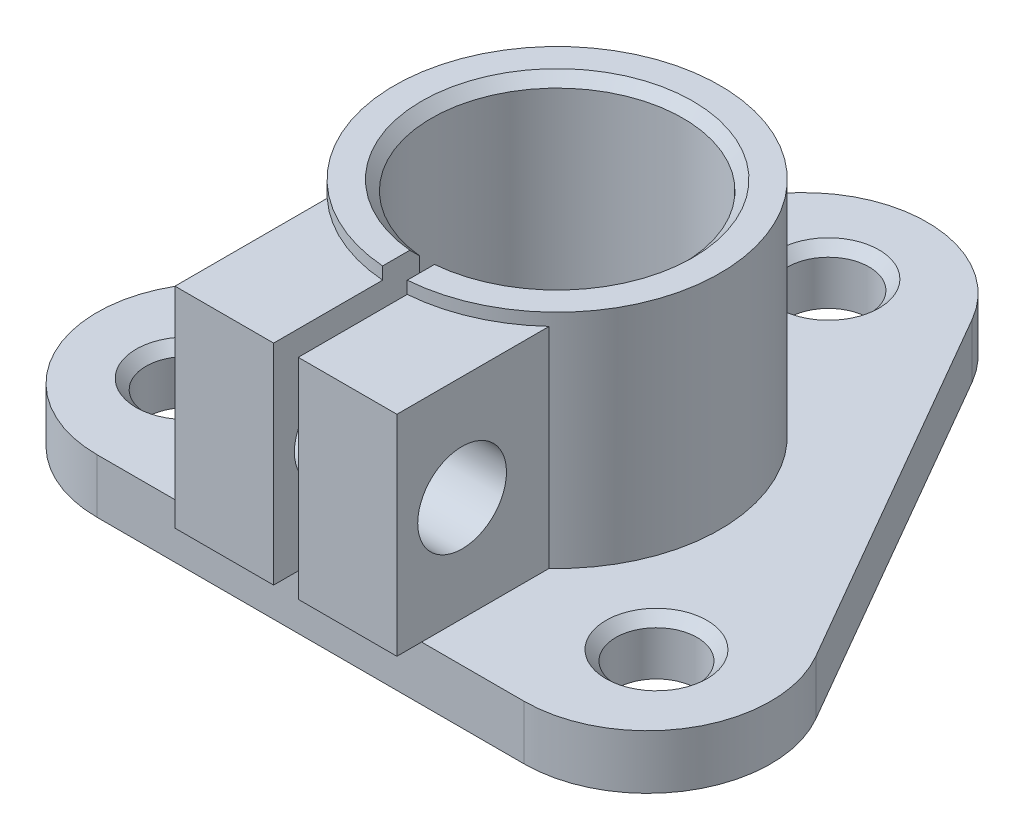
ISO-10303-21;
HEADER;
FILE_DESCRIPTION(('STEP AP214'),'2;1');
FILE_NAME('part.step','',(''),(''),'','','');
FILE_SCHEMA(('AUTOMOTIVE_DESIGN { 1 0 10303 214 1 1 1 1 }'));
ENDSEC;
DATA;
#1=APPLICATION_CONTEXT('core data for automotive mechanical design processes');
#2=APPLICATION_PROTOCOL_DEFINITION('international standard','automotive_design',2000,#1);
#3=PRODUCT_CONTEXT('',#1,'mechanical');
#4=PRODUCT('Part','Part','',(#3));
#5=PRODUCT_RELATED_PRODUCT_CATEGORY('part','',(#4));
#6=PRODUCT_DEFINITION_FORMATION('','',#4);
#7=PRODUCT_DEFINITION_CONTEXT('part definition',#1,'design');
#8=PRODUCT_DEFINITION('design','',#6,#7);
#9=PRODUCT_DEFINITION_SHAPE('','',#8);
#10=(LENGTH_UNIT() NAMED_UNIT(*) SI_UNIT(.MILLI.,.METRE.));
#11=(NAMED_UNIT(*) PLANE_ANGLE_UNIT() SI_UNIT($,.RADIAN.));
#12=(NAMED_UNIT(*) SI_UNIT($,.STERADIAN.) SOLID_ANGLE_UNIT());
#13=UNCERTAINTY_MEASURE_WITH_UNIT(LENGTH_MEASURE(1.E-05),#10,'distance_accuracy_value','');
#14=(GEOMETRIC_REPRESENTATION_CONTEXT(3) GLOBAL_UNCERTAINTY_ASSIGNED_CONTEXT((#13)) GLOBAL_UNIT_ASSIGNED_CONTEXT((#10,
#11,#12)) REPRESENTATION_CONTEXT('',''));
#15=CARTESIAN_POINT('',(0.,0.,0.));
#16=DIRECTION('',(0.,0.,1.));
#17=DIRECTION('',(1.,0.,0.));
#18=AXIS2_PLACEMENT_3D('',#15,#16,#17);
#19=CARTESIAN_POINT('',(0.,2.2,0.));
#20=DIRECTION('',(0.,1.,0.));
#21=DIRECTION('',(0.,0.,1.));
#22=AXIS2_PLACEMENT_3D('',#19,#20,#21);
#23=PLANE('',#22);
#24=DIRECTION('',(1.,0.,0.));
#25=VECTOR('',#24,1.);
#26=CARTESIAN_POINT('',(-17.3205080756888,2.2,10.));
#27=LINE('',#26,#25);
#28=CARTESIAN_POINT('',(-0.5,2.2,10.));
#29=VERTEX_POINT('',#28);
#30=CARTESIAN_POINT('',(0.5,2.2,10.));
#31=VERTEX_POINT('',#30);
#32=EDGE_CURVE('E309',#29,#31,#27,.T.);
#33=ORIENTED_EDGE('',*,*,#32,.T.);
#34=DIRECTION('',(0.,0.,-1.));
#35=VECTOR('',#34,1.);
#36=CARTESIAN_POINT('',(0.5,2.2,11.));
#37=LINE('',#36,#35);
#38=CARTESIAN_POINT('',(0.5,2.2,6.6));
#39=VERTEX_POINT('',#38);
#40=EDGE_CURVE('E531',#31,#39,#37,.T.);
#41=ORIENTED_EDGE('',*,*,#40,.T.);
#42=DIRECTION('',(-1.,0.,0.));
#43=VECTOR('',#42,1.);
#44=CARTESIAN_POINT('',(0.,2.2,6.6));
#45=LINE('',#44,#43);
#46=CARTESIAN_POINT('',(-0.499999999999999,2.2,6.6));
#47=VERTEX_POINT('',#46);
#48=EDGE_CURVE('E279',#39,#47,#45,.T.);
#49=ORIENTED_EDGE('',*,*,#48,.T.);
#50=DIRECTION('',(0.,0.,-1.));
#51=VECTOR('',#50,1.);
#52=CARTESIAN_POINT('',(-0.5,2.2,11.));
#53=LINE('',#52,#51);
#54=EDGE_CURVE('E247',#29,#47,#53,.T.);
#55=ORIENTED_EDGE('',*,*,#54,.F.);
#56=EDGE_LOOP('',(#33,#41,#49,#55));
#57=FACE_BOUND('',#56,.T.);
#58=ADVANCED_FACE('F49',(#57),#23,.T.);
#59=CARTESIAN_POINT('',(0.,2.2,-11.));
#60=DIRECTION('',(0.,1.,0.));
#61=DIRECTION('',(0.,0.,1.));
#62=AXIS2_PLACEMENT_3D('',#59,#60,#61);
#63=CIRCLE('',#62,2.04999999999999);
#64=CARTESIAN_POINT('',(0.,2.2,-8.95000000000001));
#65=VERTEX_POINT('',#64);
#66=EDGE_CURVE('E374',#65,#65,#63,.F.);
#67=ORIENTED_EDGE('',*,*,#66,.T.);
#68=EDGE_LOOP('',(#67));
#69=FACE_BOUND('',#68,.T.);
#70=CARTESIAN_POINT('',(9.52627944162883,2.2,5.5));
#71=DIRECTION('',(0.,1.,0.));
#72=DIRECTION('',(0.,0.,1.));
#73=AXIS2_PLACEMENT_3D('',#70,#71,#72);
#74=CIRCLE('',#73,2.05);
#75=CARTESIAN_POINT('',(9.52627944162883,2.2,7.55));
#76=VERTEX_POINT('',#75);
#77=EDGE_CURVE('E371',#76,#76,#74,.F.);
#78=ORIENTED_EDGE('',*,*,#77,.T.);
#79=EDGE_LOOP('',(#78));
#80=FACE_BOUND('',#79,.T.);
#81=CARTESIAN_POINT('',(-9.52627944162883,2.2,5.5));
#82=DIRECTION('',(0.,1.,0.));
#83=DIRECTION('',(0.,0.,1.));
#84=AXIS2_PLACEMENT_3D('',#81,#82,#83);
#85=CIRCLE('',#84,2.05);
#86=CARTESIAN_POINT('',(-9.52627944162883,2.2,7.55));
#87=VERTEX_POINT('',#86);
#88=EDGE_CURVE('E368',#87,#87,#85,.F.);
#89=ORIENTED_EDGE('',*,*,#88,.T.);
#90=EDGE_LOOP('',(#89));
#91=FACE_BOUND('',#90,.T.);
#92=CARTESIAN_POINT('',(0.,2.2,0.));
#93=DIRECTION('',(0.,1.,0.));
#94=DIRECTION('',(1.,0.,0.));
#95=AXIS2_PLACEMENT_3D('',#92,#93,#94);
#96=CIRCLE('',#95,6.6);
#97=CARTESIAN_POINT('',(4.5,2.2,4.82804308182932));
#98=VERTEX_POINT('',#97);
#99=CARTESIAN_POINT('',(-4.5,2.2,4.82804308182932));
#100=VERTEX_POINT('',#99);
#101=EDGE_CURVE('E287',#98,#100,#96,.T.);
#102=ORIENTED_EDGE('',*,*,#101,.F.);
#103=DIRECTION('',(0.,0.,-1.));
#104=VECTOR('',#103,1.);
#105=CARTESIAN_POINT('',(4.5,2.2,11.));
#106=LINE('',#105,#104);
#107=CARTESIAN_POINT('',(4.5,2.2,10.));
#108=VERTEX_POINT('',#107);
#109=EDGE_CURVE('E521',#108,#98,#106,.T.);
#110=ORIENTED_EDGE('',*,*,#109,.F.);
#111=CARTESIAN_POINT('',(8.66025403784438,2.2,10.));
#112=VERTEX_POINT('',#111);
#113=EDGE_CURVE('E310',#108,#112,#27,.T.);
#114=ORIENTED_EDGE('',*,*,#113,.T.);
#115=CARTESIAN_POINT('',(8.66025403784438,2.2,5.));
#116=DIRECTION('',(0.,1.,0.));
#117=DIRECTION('',(0.,0.,1.));
#118=AXIS2_PLACEMENT_3D('',#115,#116,#117);
#119=CIRCLE('',#118,5.);
#120=CARTESIAN_POINT('',(12.9903810567666,2.2,2.5));
#121=VERTEX_POINT('',#120);
#122=EDGE_CURVE('E345',#112,#121,#119,.T.);
#123=ORIENTED_EDGE('',*,*,#122,.T.);
#124=DIRECTION('',(-0.5,0.,-0.866025403784439));
#125=VECTOR('',#124,1.);
#126=CARTESIAN_POINT('',(17.3205080756888,2.2,10.));
#127=LINE('',#126,#125);
#128=CARTESIAN_POINT('',(4.3301270189222,2.2,-12.5));
#129=VERTEX_POINT('',#128);
#130=EDGE_CURVE('E308',#121,#129,#127,.T.);
#131=ORIENTED_EDGE('',*,*,#130,.T.);
#132=CARTESIAN_POINT('',(0.,2.2,-10.));
#133=DIRECTION('',(0.,1.,0.));
#134=DIRECTION('',(0.,0.,1.));
#135=AXIS2_PLACEMENT_3D('',#132,#133,#134);
#136=CIRCLE('',#135,5.);
#137=CARTESIAN_POINT('',(-4.33012701892219,2.2,-12.5));
#138=VERTEX_POINT('',#137);
#139=EDGE_CURVE('E341',#129,#138,#136,.T.);
#140=ORIENTED_EDGE('',*,*,#139,.T.);
#141=DIRECTION('',(-0.5,0.,0.866025403784439));
#142=VECTOR('',#141,1.);
#143=CARTESIAN_POINT('',(0.,2.2,-20.));
#144=LINE('',#143,#142);
#145=CARTESIAN_POINT('',(-12.9903810567666,2.2,2.50000000000001));
#146=VERTEX_POINT('',#145);
#147=EDGE_CURVE('E313',#138,#146,#144,.T.);
#148=ORIENTED_EDGE('',*,*,#147,.T.);
#149=CARTESIAN_POINT('',(-8.66025403784439,2.2,5.));
#150=DIRECTION('',(0.,1.,0.));
#151=DIRECTION('',(0.,0.,1.));
#152=AXIS2_PLACEMENT_3D('',#149,#150,#151);
#153=CIRCLE('',#152,5.);
#154=CARTESIAN_POINT('',(-8.66025403784439,2.2,10.));
#155=VERTEX_POINT('',#154);
#156=EDGE_CURVE('E343',#146,#155,#153,.T.);
#157=ORIENTED_EDGE('',*,*,#156,.T.);
#158=CARTESIAN_POINT('',(-4.5,2.2,10.));
#159=VERTEX_POINT('',#158);
#160=EDGE_CURVE('E305',#155,#159,#27,.T.);
#161=ORIENTED_EDGE('',*,*,#160,.T.);
#162=DIRECTION('',(0.,0.,-1.));
#163=VECTOR('',#162,1.);
#164=CARTESIAN_POINT('',(-4.5,2.2,11.));
#165=LINE('',#164,#163);
#166=EDGE_CURVE('E251',#159,#100,#165,.T.);
#167=ORIENTED_EDGE('',*,*,#166,.T.);
#168=EDGE_LOOP('',(#102,#110,#114,#123,#131,#140,#148,#157,#161,#167));
#169=FACE_BOUND('',#168,.T.);
#170=ADVANCED_FACE('F408',(#69,#80,#91,#169),#23,.T.);
#171=CARTESIAN_POINT('',(0.,11.2,0.));
#172=DIRECTION('',(0.,-1.,0.));
#173=DIRECTION('',(0.,0.,-1.));
#174=AXIS2_PLACEMENT_3D('',#171,#172,#173);
#175=CYLINDRICAL_SURFACE('',#174,6.6);
#176=DIRECTION('',(0.,-1.,0.));
#177=VECTOR('',#176,1.);
#178=CARTESIAN_POINT('',(4.5,11.2,4.82804308182932));
#179=LINE('',#178,#177);
#180=CARTESIAN_POINT('',(4.5,10.7,4.82804308182932));
#181=VERTEX_POINT('',#180);
#182=EDGE_CURVE('E223',#98,#181,#179,.F.);
#183=ORIENTED_EDGE('',*,*,#182,.F.);
#184=ORIENTED_EDGE('',*,*,#101,.T.);
#185=DIRECTION('',(0.,-1.,0.));
#186=VECTOR('',#185,1.);
#187=CARTESIAN_POINT('',(-4.5,11.2,4.82804308182932));
#188=LINE('',#187,#186);
#189=CARTESIAN_POINT('',(-4.5,10.7,4.82804308182932));
#190=VERTEX_POINT('',#189);
#191=EDGE_CURVE('E233',#190,#100,#188,.T.);
#192=ORIENTED_EDGE('',*,*,#191,.F.);
#193=CARTESIAN_POINT('',(0.,10.7,0.));
#194=DIRECTION('',(0.,1.,0.));
#195=DIRECTION('',(0.,0.,1.));
#196=AXIS2_PLACEMENT_3D('',#193,#194,#195);
#197=CIRCLE('',#196,6.6);
#198=CARTESIAN_POINT('',(-0.5,10.7,6.58103335350916));
#199=VERTEX_POINT('',#198);
#200=EDGE_CURVE('E232',#199,#190,#197,.F.);
#201=ORIENTED_EDGE('',*,*,#200,.F.);
#202=DIRECTION('',(0.,-1.,0.));
#203=VECTOR('',#202,1.);
#204=CARTESIAN_POINT('',(-0.499999999999999,11.2,6.58103335350916));
#205=LINE('',#204,#203);
#206=CARTESIAN_POINT('',(-0.499999999999999,11.2,6.58103335350916));
#207=VERTEX_POINT('',#206);
#208=EDGE_CURVE('E354',#199,#207,#205,.F.);
#209=ORIENTED_EDGE('',*,*,#208,.T.);
#210=CARTESIAN_POINT('',(0.,11.2,0.));
#211=DIRECTION('',(0.,1.,0.));
#212=DIRECTION('',(1.,0.,0.));
#213=AXIS2_PLACEMENT_3D('',#210,#211,#212);
#214=CIRCLE('',#213,6.6);
#215=CARTESIAN_POINT('',(0.500000000000001,11.2,6.58103335350916));
#216=VERTEX_POINT('',#215);
#217=EDGE_CURVE('E288',#216,#207,#214,.T.);
#218=ORIENTED_EDGE('',*,*,#217,.F.);
#219=DIRECTION('',(0.,-1.,0.));
#220=VECTOR('',#219,1.);
#221=CARTESIAN_POINT('',(0.500000000000001,11.2,6.58103335350916));
#222=LINE('',#221,#220);
#223=CARTESIAN_POINT('',(0.500000000000001,10.7,6.58103335350916));
#224=VERTEX_POINT('',#223);
#225=EDGE_CURVE('E352',#224,#216,#222,.F.);
#226=ORIENTED_EDGE('',*,*,#225,.F.);
#227=CARTESIAN_POINT('',(0.,10.7,0.));
#228=DIRECTION('',(0.,1.,0.));
#229=DIRECTION('',(0.,0.,1.));
#230=AXIS2_PLACEMENT_3D('',#227,#228,#229);
#231=CIRCLE('',#230,6.6);
#232=EDGE_CURVE('E212',#181,#224,#231,.F.);
#233=ORIENTED_EDGE('',*,*,#232,.F.);
#234=EDGE_LOOP('',(#183,#184,#192,#201,#209,#218,#226,#233));
#235=FACE_BOUND('',#234,.T.);
#236=ADVANCED_FACE('F404',(#235),#175,.T.);
#237=CARTESIAN_POINT('',(-17.3205080756888,2.2,10.));
#238=DIRECTION('',(0.,0.,-1.));
#239=DIRECTION('',(-1.,0.,0.));
#240=AXIS2_PLACEMENT_3D('',#237,#238,#239);
#241=PLANE('',#240);
#242=DIRECTION('',(1.,0.,0.));
#243=VECTOR('',#242,1.);
#244=CARTESIAN_POINT('',(-17.3205080756888,0.,10.));
#245=LINE('',#244,#243);
#246=CARTESIAN_POINT('',(-8.66025403784439,0.,10.));
#247=VERTEX_POINT('',#246);
#248=CARTESIAN_POINT('',(8.66025403784438,0.,10.));
#249=VERTEX_POINT('',#248);
#250=EDGE_CURVE('E299',#247,#249,#245,.T.);
#251=ORIENTED_EDGE('',*,*,#250,.T.);
#252=DIRECTION('',(0.,-1.,0.));
#253=VECTOR('',#252,1.);
#254=CARTESIAN_POINT('',(8.66025403784438,2.2,10.));
#255=LINE('',#254,#253);
#256=EDGE_CURVE('E338',#249,#112,#255,.F.);
#257=ORIENTED_EDGE('',*,*,#256,.T.);
#258=ORIENTED_EDGE('',*,*,#113,.F.);
#259=DIRECTION('',(1.,0.,0.));
#260=VECTOR('',#259,1.);
#261=CARTESIAN_POINT('',(-17.3205080756888,2.2,10.));
#262=LINE('',#261,#260);
#263=EDGE_CURVE('E230',#31,#108,#262,.T.);
#264=ORIENTED_EDGE('',*,*,#263,.F.);
#265=ORIENTED_EDGE('',*,*,#32,.F.);
#266=DIRECTION('',(1.,0.,0.));
#267=VECTOR('',#266,1.);
#268=CARTESIAN_POINT('',(-17.3205080756888,2.2,10.));
#269=LINE('',#268,#267);
#270=EDGE_CURVE('E261',#159,#29,#269,.T.);
#271=ORIENTED_EDGE('',*,*,#270,.F.);
#272=ORIENTED_EDGE('',*,*,#160,.F.);
#273=DIRECTION('',(0.,-1.,0.));
#274=VECTOR('',#273,1.);
#275=CARTESIAN_POINT('',(-8.66025403784439,2.2,10.));
#276=LINE('',#275,#274);
#277=EDGE_CURVE('E335',#155,#247,#276,.T.);
#278=ORIENTED_EDGE('',*,*,#277,.T.);
#279=EDGE_LOOP('',(#251,#257,#258,#264,#265,#271,#272,#278));
#280=FACE_BOUND('',#279,.T.);
#281=ADVANCED_FACE('F407',(#280),#241,.F.);
#282=CARTESIAN_POINT('',(17.3205080756888,2.2,10.));
#283=DIRECTION('',(-0.866025403784439,0.,0.5));
#284=DIRECTION('',(0.5,0.,0.866025403784439));
#285=AXIS2_PLACEMENT_3D('',#282,#283,#284);
#286=PLANE('',#285);
#287=ORIENTED_EDGE('',*,*,#130,.F.);
#288=DIRECTION('',(0.,-1.,0.));
#289=VECTOR('',#288,1.);
#290=CARTESIAN_POINT('',(12.9903810567666,2.2,2.5));
#291=LINE('',#290,#289);
#292=CARTESIAN_POINT('',(12.9903810567666,0.,2.5));
#293=VERTEX_POINT('',#292);
#294=EDGE_CURVE('E326',#121,#293,#291,.T.);
#295=ORIENTED_EDGE('',*,*,#294,.T.);
#296=DIRECTION('',(-0.5,0.,-0.866025403784439));
#297=VECTOR('',#296,1.);
#298=CARTESIAN_POINT('',(17.3205080756888,0.,10.));
#299=LINE('',#298,#297);
#300=CARTESIAN_POINT('',(4.3301270189222,0.,-12.5));
#301=VERTEX_POINT('',#300);
#302=EDGE_CURVE('E319',#293,#301,#299,.T.);
#303=ORIENTED_EDGE('',*,*,#302,.T.);
#304=DIRECTION('',(0.,-1.,0.));
#305=VECTOR('',#304,1.);
#306=CARTESIAN_POINT('',(4.3301270189222,2.2,-12.5));
#307=LINE('',#306,#305);
#308=EDGE_CURVE('E316',#301,#129,#307,.F.);
#309=ORIENTED_EDGE('',*,*,#308,.T.);
#310=EDGE_LOOP('',(#287,#295,#303,#309));
#311=FACE_BOUND('',#310,.T.);
#312=ADVANCED_FACE('F435',(#311),#286,.F.);
#313=CARTESIAN_POINT('',(0.,2.2,-20.));
#314=DIRECTION('',(0.866025403784439,0.,0.5));
#315=DIRECTION('',(0.5,0.,-0.866025403784439));
#316=AXIS2_PLACEMENT_3D('',#313,#314,#315);
#317=PLANE('',#316);
#318=DIRECTION('',(-0.5,0.,0.866025403784439));
#319=VECTOR('',#318,1.);
#320=CARTESIAN_POINT('',(0.,0.,-20.));
#321=LINE('',#320,#319);
#322=CARTESIAN_POINT('',(-4.33012701892219,0.,-12.5));
#323=VERTEX_POINT('',#322);
#324=CARTESIAN_POINT('',(-12.9903810567666,0.,2.50000000000001));
#325=VERTEX_POINT('',#324);
#326=EDGE_CURVE('E322',#323,#325,#321,.T.);
#327=ORIENTED_EDGE('',*,*,#326,.T.);
#328=DIRECTION('',(0.,-1.,0.));
#329=VECTOR('',#328,1.);
#330=CARTESIAN_POINT('',(-12.9903810567666,2.2,2.5));
#331=LINE('',#330,#329);
#332=EDGE_CURVE('E350',#325,#146,#331,.F.);
#333=ORIENTED_EDGE('',*,*,#332,.T.);
#334=ORIENTED_EDGE('',*,*,#147,.F.);
#335=DIRECTION('',(0.,-1.,0.));
#336=VECTOR('',#335,1.);
#337=CARTESIAN_POINT('',(-4.33012701892219,2.2,-12.5));
#338=LINE('',#337,#336);
#339=EDGE_CURVE('E347',#138,#323,#338,.T.);
#340=ORIENTED_EDGE('',*,*,#339,.T.);
#341=EDGE_LOOP('',(#327,#333,#334,#340));
#342=FACE_BOUND('',#341,.T.);
#343=ADVANCED_FACE('F431',(#342),#317,.F.);
#344=CARTESIAN_POINT('',(0.,0.,0.));
#345=DIRECTION('',(0.,1.,0.));
#346=DIRECTION('',(0.,0.,1.));
#347=AXIS2_PLACEMENT_3D('',#344,#345,#346);
#348=PLANE('',#347);
#349=CARTESIAN_POINT('',(0.,0.,0.));
#350=DIRECTION('',(0.,1.,0.));
#351=DIRECTION('',(0.,0.,1.));
#352=AXIS2_PLACEMENT_3D('',#349,#350,#351);
#353=CIRCLE('',#352,5.1);
#354=CARTESIAN_POINT('',(0.,0.,5.1));
#355=VERTEX_POINT('',#354);
#356=EDGE_CURVE('E291',#355,#355,#353,.F.);
#357=ORIENTED_EDGE('',*,*,#356,.F.);
#358=EDGE_LOOP('',(#357));
#359=FACE_BOUND('',#358,.T.);
#360=CARTESIAN_POINT('',(0.,0.,-11.));
#361=DIRECTION('',(0.,1.,0.));
#362=DIRECTION('',(0.,0.,1.));
#363=AXIS2_PLACEMENT_3D('',#360,#361,#362);
#364=CIRCLE('',#363,1.65);
#365=CARTESIAN_POINT('',(0.,0.,-9.35));
#366=VERTEX_POINT('',#365);
#367=EDGE_CURVE('E296',#366,#366,#364,.F.);
#368=ORIENTED_EDGE('',*,*,#367,.F.);
#369=EDGE_LOOP('',(#368));
#370=FACE_BOUND('',#369,.T.);
#371=CARTESIAN_POINT('',(9.52627944162883,0.,5.5));
#372=DIRECTION('',(0.,1.,0.));
#373=DIRECTION('',(0.,0.,1.));
#374=AXIS2_PLACEMENT_3D('',#371,#372,#373);
#375=CIRCLE('',#374,1.65);
#376=CARTESIAN_POINT('',(9.52627944162883,0.,7.15));
#377=VERTEX_POINT('',#376);
#378=EDGE_CURVE('E300',#377,#377,#375,.F.);
#379=ORIENTED_EDGE('',*,*,#378,.F.);
#380=EDGE_LOOP('',(#379));
#381=FACE_BOUND('',#380,.T.);
#382=CARTESIAN_POINT('',(-9.52627944162883,0.,5.5));
#383=DIRECTION('',(0.,1.,0.));
#384=DIRECTION('',(0.,0.,1.));
#385=AXIS2_PLACEMENT_3D('',#382,#383,#384);
#386=CIRCLE('',#385,1.65);
#387=CARTESIAN_POINT('',(-9.52627944162883,0.,7.15));
#388=VERTEX_POINT('',#387);
#389=EDGE_CURVE('E295',#388,#388,#386,.F.);
#390=ORIENTED_EDGE('',*,*,#389,.F.);
#391=EDGE_LOOP('',(#390));
#392=FACE_BOUND('',#391,.T.);
#393=ORIENTED_EDGE('',*,*,#302,.F.);
#394=CARTESIAN_POINT('',(8.66025403784438,0.,5.));
#395=DIRECTION('',(0.,1.,0.));
#396=DIRECTION('',(0.,0.,1.));
#397=AXIS2_PLACEMENT_3D('',#394,#395,#396);
#398=CIRCLE('',#397,5.);
#399=EDGE_CURVE('E333',#293,#249,#398,.F.);
#400=ORIENTED_EDGE('',*,*,#399,.T.);
#401=ORIENTED_EDGE('',*,*,#250,.F.);
#402=CARTESIAN_POINT('',(-8.66025403784439,0.,5.));
#403=DIRECTION('',(0.,1.,0.));
#404=DIRECTION('',(0.,0.,1.));
#405=AXIS2_PLACEMENT_3D('',#402,#403,#404);
#406=CIRCLE('',#405,5.);
#407=EDGE_CURVE('E331',#247,#325,#406,.F.);
#408=ORIENTED_EDGE('',*,*,#407,.T.);
#409=ORIENTED_EDGE('',*,*,#326,.F.);
#410=CARTESIAN_POINT('',(0.,0.,-10.));
#411=DIRECTION('',(0.,1.,0.));
#412=DIRECTION('',(0.,0.,1.));
#413=AXIS2_PLACEMENT_3D('',#410,#411,#412);
#414=CIRCLE('',#413,5.);
#415=EDGE_CURVE('E329',#323,#301,#414,.F.);
#416=ORIENTED_EDGE('',*,*,#415,.T.);
#417=EDGE_LOOP('',(#393,#400,#401,#408,#409,#416));
#418=FACE_BOUND('',#417,.T.);
#419=ADVANCED_FACE('F424',(#359,#370,#381,#392,#418),#348,.F.);
#420=CARTESIAN_POINT('',(-9.52627944162883,-0.00100000000000013,5.5));
#421=DIRECTION('',(0.,1.,0.));
#422=DIRECTION('',(0.,0.,1.));
#423=AXIS2_PLACEMENT_3D('',#420,#421,#422);
#424=CYLINDRICAL_SURFACE('',#423,1.65);
#425=CARTESIAN_POINT('',(-9.52627944162883,1.8,5.5));
#426=DIRECTION('',(0.,1.,0.));
#427=DIRECTION('',(0.,0.,1.));
#428=AXIS2_PLACEMENT_3D('',#425,#426,#427);
#429=CIRCLE('',#428,1.65);
#430=CARTESIAN_POINT('',(-9.52627944162883,1.8,7.15));
#431=VERTEX_POINT('',#430);
#432=EDGE_CURVE('E380',#431,#431,#429,.T.);
#433=ORIENTED_EDGE('',*,*,#432,.T.);
#434=EDGE_LOOP('',(#433));
#435=FACE_BOUND('',#434,.T.);
#436=ORIENTED_EDGE('',*,*,#389,.T.);
#437=EDGE_LOOP('',(#436));
#438=FACE_BOUND('',#437,.T.);
#439=ADVANCED_FACE('F420',(#435,#438),#424,.F.);
#440=CARTESIAN_POINT('',(9.52627944162883,-0.00100000000000013,5.5));
#441=DIRECTION('',(0.,1.,0.));
#442=DIRECTION('',(0.,0.,1.));
#443=AXIS2_PLACEMENT_3D('',#440,#441,#442);
#444=CYLINDRICAL_SURFACE('',#443,1.65);
#445=CARTESIAN_POINT('',(9.52627944162883,1.8,5.5));
#446=DIRECTION('',(0.,1.,0.));
#447=DIRECTION('',(0.,0.,1.));
#448=AXIS2_PLACEMENT_3D('',#445,#446,#447);
#449=CIRCLE('',#448,1.65);
#450=CARTESIAN_POINT('',(9.52627944162883,1.8,7.15));
#451=VERTEX_POINT('',#450);
#452=EDGE_CURVE('E377',#451,#451,#449,.T.);
#453=ORIENTED_EDGE('',*,*,#452,.T.);
#454=EDGE_LOOP('',(#453));
#455=FACE_BOUND('',#454,.T.);
#456=ORIENTED_EDGE('',*,*,#378,.T.);
#457=EDGE_LOOP('',(#456));
#458=FACE_BOUND('',#457,.T.);
#459=ADVANCED_FACE('F416',(#455,#458),#444,.F.);
#460=CARTESIAN_POINT('',(0.,-0.00100000000000013,-11.));
#461=DIRECTION('',(0.,1.,0.));
#462=DIRECTION('',(0.,0.,1.));
#463=AXIS2_PLACEMENT_3D('',#460,#461,#462);
#464=CYLINDRICAL_SURFACE('',#463,1.65);
#465=CARTESIAN_POINT('',(0.,1.80000000000001,-11.));
#466=DIRECTION('',(0.,1.,0.));
#467=DIRECTION('',(0.,0.,1.));
#468=AXIS2_PLACEMENT_3D('',#465,#466,#467);
#469=CIRCLE('',#468,1.65);
#470=CARTESIAN_POINT('',(0.,1.80000000000001,-9.35));
#471=VERTEX_POINT('',#470);
#472=EDGE_CURVE('E360',#471,#471,#469,.T.);
#473=ORIENTED_EDGE('',*,*,#472,.T.);
#474=EDGE_LOOP('',(#473));
#475=FACE_BOUND('',#474,.T.);
#476=ORIENTED_EDGE('',*,*,#367,.T.);
#477=EDGE_LOOP('',(#476));
#478=FACE_BOUND('',#477,.T.);
#479=ADVANCED_FACE('F412',(#475,#478),#464,.F.);
#480=CARTESIAN_POINT('',(0.,-0.00100000000000013,0.));
#481=DIRECTION('',(0.,1.,0.));
#482=DIRECTION('',(0.,0.,1.));
#483=AXIS2_PLACEMENT_3D('',#480,#481,#482);
#484=CYLINDRICAL_SURFACE('',#483,5.1);
#485=ORIENTED_EDGE('',*,*,#356,.T.);
#486=EDGE_LOOP('',(#485));
#487=FACE_BOUND('',#486,.T.);
#488=DIRECTION('',(0.,1.,0.));
#489=VECTOR('',#488,1.);
#490=CARTESIAN_POINT('',(0.500000000000001,-0.00100000000000013,5.07543101617981));
#491=LINE('',#490,#489);
#492=CARTESIAN_POINT('',(0.500000000000001,10.8,5.07543101617981));
#493=VERTEX_POINT('',#492);
#494=CARTESIAN_POINT('',(0.500000000000001,1.2,5.07543101617981));
#495=VERTEX_POINT('',#494);
#496=EDGE_CURVE('E283',#493,#495,#491,.F.);
#497=ORIENTED_EDGE('',*,*,#496,.F.);
#498=CARTESIAN_POINT('',(0.,10.8,0.));
#499=DIRECTION('',(0.,1.,0.));
#500=DIRECTION('',(0.,0.,1.));
#501=AXIS2_PLACEMENT_3D('',#498,#499,#500);
#502=CIRCLE('',#501,5.1);
#503=CARTESIAN_POINT('',(-0.499999999999999,10.8,5.07543101617981));
#504=VERTEX_POINT('',#503);
#505=EDGE_CURVE('E383',#493,#504,#502,.T.);
#506=ORIENTED_EDGE('',*,*,#505,.T.);
#507=DIRECTION('',(0.,1.,0.));
#508=VECTOR('',#507,1.);
#509=CARTESIAN_POINT('',(-0.499999999999999,-0.00100000000000013,5.07543101617981));
#510=LINE('',#509,#508);
#511=CARTESIAN_POINT('',(-0.499999999999999,1.2,5.07543101617981));
#512=VERTEX_POINT('',#511);
#513=EDGE_CURVE('E285',#504,#512,#510,.F.);
#514=ORIENTED_EDGE('',*,*,#513,.T.);
#515=CARTESIAN_POINT('',(0.,1.2,0.));
#516=DIRECTION('',(0.,-1.,0.));
#517=DIRECTION('',(0.,0.,-1.));
#518=AXIS2_PLACEMENT_3D('',#515,#516,#517);
#519=CIRCLE('',#518,5.1);
#520=EDGE_CURVE('E357',#512,#495,#519,.F.);
#521=ORIENTED_EDGE('',*,*,#520,.T.);
#522=EDGE_LOOP('',(#497,#506,#514,#521));
#523=FACE_BOUND('',#522,.T.);
#524=ADVANCED_FACE('F403',(#487,#523),#484,.F.);
#525=CARTESIAN_POINT('',(0.,11.2,0.));
#526=DIRECTION('',(0.,1.,0.));
#527=DIRECTION('',(0.,0.,1.));
#528=AXIS2_PLACEMENT_3D('',#525,#526,#527);
#529=PLANE('',#528);
#530=DIRECTION('',(0.,0.,1.));
#531=VECTOR('',#530,1.);
#532=CARTESIAN_POINT('',(-0.5,11.2,0.));
#533=LINE('',#532,#531);
#534=CARTESIAN_POINT('',(-0.499999999999999,11.2,5.47722557505167));
#535=VERTEX_POINT('',#534);
#536=EDGE_CURVE('E264',#535,#207,#533,.T.);
#537=ORIENTED_EDGE('',*,*,#536,.F.);
#538=CARTESIAN_POINT('',(0.,11.2,0.));
#539=DIRECTION('',(0.,1.,0.));
#540=DIRECTION('',(0.,0.,1.));
#541=AXIS2_PLACEMENT_3D('',#538,#539,#540);
#542=CIRCLE('',#541,5.50000000000001);
#543=CARTESIAN_POINT('',(0.500000000000001,11.2,5.47722557505167));
#544=VERTEX_POINT('',#543);
#545=EDGE_CURVE('E64',#535,#544,#542,.F.);
#546=ORIENTED_EDGE('',*,*,#545,.T.);
#547=DIRECTION('',(0.,0.,1.));
#548=VECTOR('',#547,1.);
#549=CARTESIAN_POINT('',(0.5,11.2,0.));
#550=LINE('',#549,#548);
#551=EDGE_CURVE('E268',#544,#216,#550,.T.);
#552=ORIENTED_EDGE('',*,*,#551,.T.);
#553=ORIENTED_EDGE('',*,*,#217,.T.);
#554=EDGE_LOOP('',(#537,#546,#552,#553));
#555=FACE_BOUND('',#554,.T.);
#556=ADVANCED_FACE('F399',(#555),#529,.T.);
#557=CARTESIAN_POINT('',(8.66025403784438,2.2,5.));
#558=DIRECTION('',(0.,-1.,0.));
#559=DIRECTION('',(0.,0.,-1.));
#560=AXIS2_PLACEMENT_3D('',#557,#558,#559);
#561=CYLINDRICAL_SURFACE('',#560,5.);
#562=ORIENTED_EDGE('',*,*,#122,.F.);
#563=ORIENTED_EDGE('',*,*,#256,.F.);
#564=ORIENTED_EDGE('',*,*,#399,.F.);
#565=ORIENTED_EDGE('',*,*,#294,.F.);
#566=EDGE_LOOP('',(#562,#563,#564,#565));
#567=FACE_BOUND('',#566,.T.);
#568=ADVANCED_FACE('F402',(#567),#561,.T.);
#569=CARTESIAN_POINT('',(-8.66025403784439,2.2,5.));
#570=DIRECTION('',(0.,-1.,0.));
#571=DIRECTION('',(0.,0.,-1.));
#572=AXIS2_PLACEMENT_3D('',#569,#570,#571);
#573=CYLINDRICAL_SURFACE('',#572,5.);
#574=ORIENTED_EDGE('',*,*,#156,.F.);
#575=ORIENTED_EDGE('',*,*,#332,.F.);
#576=ORIENTED_EDGE('',*,*,#407,.F.);
#577=ORIENTED_EDGE('',*,*,#277,.F.);
#578=EDGE_LOOP('',(#574,#575,#576,#577));
#579=FACE_BOUND('',#578,.T.);
#580=ADVANCED_FACE('F445',(#579),#573,.T.);
#581=CARTESIAN_POINT('',(0.,2.2,-10.));
#582=DIRECTION('',(0.,-1.,0.));
#583=DIRECTION('',(0.,0.,-1.));
#584=AXIS2_PLACEMENT_3D('',#581,#582,#583);
#585=CYLINDRICAL_SURFACE('',#584,5.);
#586=ORIENTED_EDGE('',*,*,#139,.F.);
#587=ORIENTED_EDGE('',*,*,#308,.F.);
#588=ORIENTED_EDGE('',*,*,#415,.F.);
#589=ORIENTED_EDGE('',*,*,#339,.F.);
#590=EDGE_LOOP('',(#586,#587,#588,#589));
#591=FACE_BOUND('',#590,.T.);
#592=ADVANCED_FACE('F449',(#591),#585,.T.);
#593=CARTESIAN_POINT('',(0.,1.2,0.));
#594=DIRECTION('',(0.,-1.,0.));
#595=DIRECTION('',(-1.,0.,0.));
#596=AXIS2_PLACEMENT_3D('',#593,#594,#595);
#597=PLANE('',#596);
#598=DIRECTION('',(0.,0.,1.));
#599=VECTOR('',#598,1.);
#600=CARTESIAN_POINT('',(-0.5,1.2,0.));
#601=LINE('',#600,#599);
#602=CARTESIAN_POINT('',(-0.499999999999999,1.2,6.6));
#603=VERTEX_POINT('',#602);
#604=EDGE_CURVE('E265',#512,#603,#601,.T.);
#605=ORIENTED_EDGE('',*,*,#604,.T.);
#606=DIRECTION('',(-1.,0.,0.));
#607=VECTOR('',#606,1.);
#608=CARTESIAN_POINT('',(0.500000000000001,1.2,6.6));
#609=LINE('',#608,#607);
#610=CARTESIAN_POINT('',(0.500000000000001,1.2,6.6));
#611=VERTEX_POINT('',#610);
#612=EDGE_CURVE('E267',#611,#603,#609,.T.);
#613=ORIENTED_EDGE('',*,*,#612,.F.);
#614=DIRECTION('',(0.,0.,1.));
#615=VECTOR('',#614,1.);
#616=CARTESIAN_POINT('',(0.5,1.2,0.));
#617=LINE('',#616,#615);
#618=EDGE_CURVE('E271',#495,#611,#617,.T.);
#619=ORIENTED_EDGE('',*,*,#618,.F.);
#620=ORIENTED_EDGE('',*,*,#520,.F.);
#621=EDGE_LOOP('',(#605,#613,#619,#620));
#622=FACE_BOUND('',#621,.T.);
#623=ADVANCED_FACE('F396',(#622),#597,.F.);
#624=CARTESIAN_POINT('',(-0.5,1.2,0.));
#625=DIRECTION('',(-1.,0.,0.));
#626=DIRECTION('',(0.,0.,1.));
#627=AXIS2_PLACEMENT_3D('',#624,#625,#626);
#628=PLANE('',#627);
#629=CARTESIAN_POINT('',(-0.499999999999999,6.45,8.35701797148047));
#630=DIRECTION('',(-1.,0.,0.));
#631=DIRECTION('',(0.,0.,1.));
#632=AXIS2_PLACEMENT_3D('',#629,#630,#631);
#633=CIRCLE('',#632,1.8);
#634=CARTESIAN_POINT('',(-0.499999999999999,6.45,10.1570179714805));
#635=VERTEX_POINT('',#634);
#636=EDGE_CURVE('E535',#635,#635,#633,.T.);
#637=ORIENTED_EDGE('',*,*,#636,.T.);
#638=EDGE_LOOP('',(#637));
#639=FACE_BOUND('',#638,.T.);
#640=ORIENTED_EDGE('',*,*,#513,.F.);
#641=CARTESIAN_POINT('',(-0.499999999999999,10.8,5.07543101617981));
#642=CARTESIAN_POINT('',(-0.499999999999999,10.8666553041973,5.14240808774853));
#643=CARTESIAN_POINT('',(-0.499999999999999,10.9333162896383,5.20937950344797));
#644=CARTESIAN_POINT('',(-0.499999999999999,11.0666496229716,5.34331102307191));
#645=CARTESIAN_POINT('',(-0.499999999999999,11.1333219708639,5.41027112699643));
#646=CARTESIAN_POINT('',(-0.499999999999999,11.2,5.47722557505167));
#647=B_SPLINE_CURVE_WITH_KNOTS('',3,(#641,#642,#643,#644,#645,#646),.UNSPECIFIED.,.F.,.F.,(4,2,
4),(0.,0.28347789597568,0.566955791797371),.UNSPECIFIED.);
#648=EDGE_CURVE('E78',#504,#535,#647,.T.);
#649=ORIENTED_EDGE('',*,*,#648,.T.);
#650=ORIENTED_EDGE('',*,*,#536,.T.);
#651=ORIENTED_EDGE('',*,*,#208,.F.);
#652=DIRECTION('',(0.,0.,-1.));
#653=VECTOR('',#652,1.);
#654=CARTESIAN_POINT('',(-0.5,10.7,11.));
#655=LINE('',#654,#653);
#656=CARTESIAN_POINT('',(-0.5,10.7,11.));
#657=VERTEX_POINT('',#656);
#658=EDGE_CURVE('E258',#657,#199,#655,.T.);
#659=ORIENTED_EDGE('',*,*,#658,.F.);
#660=DIRECTION('',(0.,1.,0.));
#661=VECTOR('',#660,1.);
#662=CARTESIAN_POINT('',(-0.5,10.7,11.));
#663=LINE('',#662,#661);
#664=CARTESIAN_POINT('',(-0.5,2.2,11.));
#665=VERTEX_POINT('',#664);
#666=EDGE_CURVE('E236',#665,#657,#663,.T.);
#667=ORIENTED_EDGE('',*,*,#666,.F.);
#668=EDGE_CURVE('E248',#665,#29,#53,.T.);
#669=ORIENTED_EDGE('',*,*,#668,.T.);
#670=ORIENTED_EDGE('',*,*,#54,.T.);
#671=DIRECTION('',(0.,1.,0.));
#672=VECTOR('',#671,1.);
#673=CARTESIAN_POINT('',(-0.499999999999999,1.2,6.6));
#674=LINE('',#673,#672);
#675=EDGE_CURVE('E273',#603,#47,#674,.T.);
#676=ORIENTED_EDGE('',*,*,#675,.F.);
#677=ORIENTED_EDGE('',*,*,#604,.F.);
#678=EDGE_LOOP('',(#640,#649,#650,#651,#659,#667,#669,#670,#676,#677));
#679=FACE_BOUND('',#678,.T.);
#680=ADVANCED_FACE('F391',(#639,#679),#628,.F.);
#681=CARTESIAN_POINT('',(0.5,1.2,0.));
#682=DIRECTION('',(-1.,0.,0.));
#683=DIRECTION('',(0.,0.,1.));
#684=AXIS2_PLACEMENT_3D('',#681,#682,#683);
#685=PLANE('',#684);
#686=CARTESIAN_POINT('',(0.500000000000002,6.45,8.35701797148047));
#687=DIRECTION('',(-1.,0.,0.));
#688=DIRECTION('',(0.,0.,1.));
#689=AXIS2_PLACEMENT_3D('',#686,#687,#688);
#690=CIRCLE('',#689,1.8);
#691=CARTESIAN_POINT('',(0.500000000000002,6.45,10.1570179714805));
#692=VERTEX_POINT('',#691);
#693=EDGE_CURVE('E364',#692,#692,#690,.T.);
#694=ORIENTED_EDGE('',*,*,#693,.F.);
#695=EDGE_LOOP('',(#694));
#696=FACE_BOUND('',#695,.T.);
#697=ORIENTED_EDGE('',*,*,#551,.F.);
#698=CARTESIAN_POINT('',(0.500000000000001,11.2,5.47722557505167));
#699=CARTESIAN_POINT('',(0.500000000000001,11.1333219708639,5.41027112699643));
#700=CARTESIAN_POINT('',(0.500000000000001,11.0666496229716,5.34331102307191));
#701=CARTESIAN_POINT('',(0.500000000000001,10.9333162896383,5.20937950344797));
#702=CARTESIAN_POINT('',(0.500000000000001,10.8666553041973,5.14240808774853));
#703=CARTESIAN_POINT('',(0.500000000000001,10.8,5.07543101617981));
#704=B_SPLINE_CURVE_WITH_KNOTS('',3,(#698,#699,#700,#701,#702,#703),.UNSPECIFIED.,.F.,.F.,(4,2,
4),(0.,0.283477895821691,0.566955791797371),.UNSPECIFIED.);
#705=EDGE_CURVE('E12',#544,#493,#704,.T.);
#706=ORIENTED_EDGE('',*,*,#705,.T.);
#707=ORIENTED_EDGE('',*,*,#496,.T.);
#708=ORIENTED_EDGE('',*,*,#618,.T.);
#709=DIRECTION('',(0.,1.,0.));
#710=VECTOR('',#709,1.);
#711=CARTESIAN_POINT('',(0.500000000000001,1.2,6.6));
#712=LINE('',#711,#710);
#713=EDGE_CURVE('E276',#611,#39,#712,.T.);
#714=ORIENTED_EDGE('',*,*,#713,.T.);
#715=ORIENTED_EDGE('',*,*,#40,.F.);
#716=CARTESIAN_POINT('',(0.5,2.2,11.));
#717=VERTEX_POINT('',#716);
#718=EDGE_CURVE('E220',#717,#31,#37,.T.);
#719=ORIENTED_EDGE('',*,*,#718,.F.);
#720=DIRECTION('',(0.,-1.,0.));
#721=VECTOR('',#720,1.);
#722=CARTESIAN_POINT('',(0.500000000000001,10.7,11.));
#723=LINE('',#722,#721);
#724=CARTESIAN_POINT('',(0.500000000000001,10.7,11.));
#725=VERTEX_POINT('',#724);
#726=EDGE_CURVE('E201',#725,#717,#723,.T.);
#727=ORIENTED_EDGE('',*,*,#726,.F.);
#728=DIRECTION('',(0.,0.,-1.));
#729=VECTOR('',#728,1.);
#730=CARTESIAN_POINT('',(0.500000000000001,10.7,11.));
#731=LINE('',#730,#729);
#732=EDGE_CURVE('E207',#725,#224,#731,.T.);
#733=ORIENTED_EDGE('',*,*,#732,.T.);
#734=ORIENTED_EDGE('',*,*,#225,.T.);
#735=EDGE_LOOP('',(#697,#706,#707,#708,#714,#715,#719,#727,#733,#734));
#736=FACE_BOUND('',#735,.T.);
#737=ADVANCED_FACE('F218',(#696,#736),#685,.T.);
#738=CARTESIAN_POINT('',(0.500000000000001,1.2,6.6));
#739=DIRECTION('',(0.,0.,-1.));
#740=DIRECTION('',(-1.,0.,0.));
#741=AXIS2_PLACEMENT_3D('',#738,#739,#740);
#742=PLANE('',#741);
#743=ORIENTED_EDGE('',*,*,#713,.F.);
#744=ORIENTED_EDGE('',*,*,#612,.T.);
#745=ORIENTED_EDGE('',*,*,#675,.T.);
#746=ORIENTED_EDGE('',*,*,#48,.F.);
#747=EDGE_LOOP('',(#743,#744,#745,#746));
#748=FACE_BOUND('',#747,.T.);
#749=ADVANCED_FACE('F398',(#748),#742,.T.);
#750=CARTESIAN_POINT('',(-0.5,2.2,11.));
#751=DIRECTION('',(0.,1.,0.));
#752=DIRECTION('',(-1.,0.,0.));
#753=AXIS2_PLACEMENT_3D('',#750,#751,#752);
#754=PLANE('',#753);
#755=CARTESIAN_POINT('',(-4.5,2.2,11.));
#756=VERTEX_POINT('',#755);
#757=EDGE_CURVE('E252',#756,#159,#165,.T.);
#758=ORIENTED_EDGE('',*,*,#757,.T.);
#759=ORIENTED_EDGE('',*,*,#270,.T.);
#760=ORIENTED_EDGE('',*,*,#668,.F.);
#761=DIRECTION('',(1.,0.,0.));
#762=VECTOR('',#761,1.);
#763=CARTESIAN_POINT('',(-0.5,2.2,11.));
#764=LINE('',#763,#762);
#765=EDGE_CURVE('E245',#756,#665,#764,.T.);
#766=ORIENTED_EDGE('',*,*,#765,.F.);
#767=EDGE_LOOP('',(#758,#759,#760,#766));
#768=FACE_BOUND('',#767,.T.);
#769=ADVANCED_FACE('F507',(#768),#754,.F.);
#770=CARTESIAN_POINT('',(-0.5,10.7,11.));
#771=DIRECTION('',(0.,-1.,0.));
#772=DIRECTION('',(0.,0.,-1.));
#773=AXIS2_PLACEMENT_3D('',#770,#771,#772);
#774=PLANE('',#773);
#775=ORIENTED_EDGE('',*,*,#658,.T.);
#776=ORIENTED_EDGE('',*,*,#200,.T.);
#777=DIRECTION('',(0.,0.,-1.));
#778=VECTOR('',#777,1.);
#779=CARTESIAN_POINT('',(-4.5,10.7,11.));
#780=LINE('',#779,#778);
#781=CARTESIAN_POINT('',(-4.5,10.7,11.));
#782=VERTEX_POINT('',#781);
#783=EDGE_CURVE('E255',#782,#190,#780,.T.);
#784=ORIENTED_EDGE('',*,*,#783,.F.);
#785=DIRECTION('',(-1.,0.,0.));
#786=VECTOR('',#785,1.);
#787=CARTESIAN_POINT('',(-0.5,10.7,11.));
#788=LINE('',#787,#786);
#789=EDGE_CURVE('E241',#657,#782,#788,.T.);
#790=ORIENTED_EDGE('',*,*,#789,.F.);
#791=EDGE_LOOP('',(#775,#776,#784,#790));
#792=FACE_BOUND('',#791,.T.);
#793=ADVANCED_FACE('F546',(#792),#774,.F.);
#794=CARTESIAN_POINT('',(-4.5,10.7,11.));
#795=DIRECTION('',(1.,0.,0.));
#796=DIRECTION('',(0.,0.,-1.));
#797=AXIS2_PLACEMENT_3D('',#794,#795,#796);
#798=PLANE('',#797);
#799=CARTESIAN_POINT('',(-4.5,6.45,8.35701797148047));
#800=DIRECTION('',(-1.,0.,0.));
#801=DIRECTION('',(0.,0.,1.));
#802=AXIS2_PLACEMENT_3D('',#799,#800,#801);
#803=CIRCLE('',#802,1.8);
#804=CARTESIAN_POINT('',(-4.5,6.45,10.1570179714805));
#805=VERTEX_POINT('',#804);
#806=EDGE_CURVE('E365',#805,#805,#803,.T.);
#807=ORIENTED_EDGE('',*,*,#806,.F.);
#808=EDGE_LOOP('',(#807));
#809=FACE_BOUND('',#808,.T.);
#810=ORIENTED_EDGE('',*,*,#783,.T.);
#811=ORIENTED_EDGE('',*,*,#191,.T.);
#812=ORIENTED_EDGE('',*,*,#166,.F.);
#813=ORIENTED_EDGE('',*,*,#757,.F.);
#814=DIRECTION('',(0.,-1.,0.));
#815=VECTOR('',#814,1.);
#816=CARTESIAN_POINT('',(-4.5,10.7,11.));
#817=LINE('',#816,#815);
#818=EDGE_CURVE('E243',#782,#756,#817,.T.);
#819=ORIENTED_EDGE('',*,*,#818,.F.);
#820=EDGE_LOOP('',(#810,#811,#812,#813,#819));
#821=FACE_BOUND('',#820,.T.);
#822=ADVANCED_FACE('F519',(#809,#821),#798,.F.);
#823=CARTESIAN_POINT('',(0.,0.,11.));
#824=DIRECTION('',(0.,0.,-1.));
#825=DIRECTION('',(-1.,0.,0.));
#826=AXIS2_PLACEMENT_3D('',#823,#824,#825);
#827=PLANE('',#826);
#828=ORIENTED_EDGE('',*,*,#666,.T.);
#829=ORIENTED_EDGE('',*,*,#789,.T.);
#830=ORIENTED_EDGE('',*,*,#818,.T.);
#831=ORIENTED_EDGE('',*,*,#765,.T.);
#832=EDGE_LOOP('',(#828,#829,#830,#831));
#833=FACE_BOUND('',#832,.T.);
#834=ADVANCED_FACE('F515',(#833),#827,.F.);
#835=CARTESIAN_POINT('',(0.5,2.2,11.));
#836=DIRECTION('',(0.,1.,0.));
#837=DIRECTION('',(-1.,0.,0.));
#838=AXIS2_PLACEMENT_3D('',#835,#836,#837);
#839=PLANE('',#838);
#840=ORIENTED_EDGE('',*,*,#718,.T.);
#841=ORIENTED_EDGE('',*,*,#263,.T.);
#842=CARTESIAN_POINT('',(4.5,2.2,11.));
#843=VERTEX_POINT('',#842);
#844=EDGE_CURVE('E529',#843,#108,#106,.T.);
#845=ORIENTED_EDGE('',*,*,#844,.F.);
#846=DIRECTION('',(1.,0.,0.));
#847=VECTOR('',#846,1.);
#848=CARTESIAN_POINT('',(0.5,2.2,11.));
#849=LINE('',#848,#847);
#850=EDGE_CURVE('E221',#717,#843,#849,.T.);
#851=ORIENTED_EDGE('',*,*,#850,.F.);
#852=EDGE_LOOP('',(#840,#841,#845,#851));
#853=FACE_BOUND('',#852,.T.);
#854=ADVANCED_FACE('F553',(#853),#839,.F.);
#855=CARTESIAN_POINT('',(4.5,10.7,11.));
#856=DIRECTION('',(-1.,0.,0.));
#857=DIRECTION('',(0.,-1.,0.));
#858=AXIS2_PLACEMENT_3D('',#855,#856,#857);
#859=PLANE('',#858);
#860=CARTESIAN_POINT('',(4.5,6.45,8.35701797148047));
#861=DIRECTION('',(-1.,0.,0.));
#862=DIRECTION('',(0.,-1.,0.));
#863=AXIS2_PLACEMENT_3D('',#860,#861,#862);
#864=CIRCLE('',#863,1.8);
#865=CARTESIAN_POINT('',(4.5,4.65,8.35701797148047));
#866=VERTEX_POINT('',#865);
#867=EDGE_CURVE('E361',#866,#866,#864,.T.);
#868=ORIENTED_EDGE('',*,*,#867,.T.);
#869=EDGE_LOOP('',(#868));
#870=FACE_BOUND('',#869,.T.);
#871=ORIENTED_EDGE('',*,*,#844,.T.);
#872=ORIENTED_EDGE('',*,*,#109,.T.);
#873=ORIENTED_EDGE('',*,*,#182,.T.);
#874=DIRECTION('',(0.,0.,-1.));
#875=VECTOR('',#874,1.);
#876=CARTESIAN_POINT('',(4.5,10.7,11.));
#877=LINE('',#876,#875);
#878=CARTESIAN_POINT('',(4.5,10.7,11.));
#879=VERTEX_POINT('',#878);
#880=EDGE_CURVE('E216',#879,#181,#877,.T.);
#881=ORIENTED_EDGE('',*,*,#880,.F.);
#882=DIRECTION('',(0.,1.,0.));
#883=VECTOR('',#882,1.);
#884=CARTESIAN_POINT('',(4.5,10.7,11.));
#885=LINE('',#884,#883);
#886=EDGE_CURVE('E204',#843,#879,#885,.T.);
#887=ORIENTED_EDGE('',*,*,#886,.F.);
#888=EDGE_LOOP('',(#871,#872,#873,#881,#887));
#889=FACE_BOUND('',#888,.T.);
#890=ADVANCED_FACE('F527',(#870,#889),#859,.F.);
#891=CARTESIAN_POINT('',(0.500000000000001,10.7,11.));
#892=DIRECTION('',(0.,-1.,0.));
#893=DIRECTION('',(0.,0.,-1.));
#894=AXIS2_PLACEMENT_3D('',#891,#892,#893);
#895=PLANE('',#894);
#896=ORIENTED_EDGE('',*,*,#880,.T.);
#897=ORIENTED_EDGE('',*,*,#232,.T.);
#898=ORIENTED_EDGE('',*,*,#732,.F.);
#899=DIRECTION('',(-1.,0.,0.));
#900=VECTOR('',#899,1.);
#901=CARTESIAN_POINT('',(0.500000000000001,10.7,11.));
#902=LINE('',#901,#900);
#903=EDGE_CURVE('E197',#879,#725,#902,.T.);
#904=ORIENTED_EDGE('',*,*,#903,.F.);
#905=EDGE_LOOP('',(#896,#897,#898,#904));
#906=FACE_BOUND('',#905,.T.);
#907=ADVANCED_FACE('F210',(#906),#895,.F.);
#908=CARTESIAN_POINT('',(0.,0.,11.));
#909=DIRECTION('',(0.,0.,1.));
#910=DIRECTION('',(1.,0.,0.));
#911=AXIS2_PLACEMENT_3D('',#908,#909,#910);
#912=PLANE('',#911);
#913=ORIENTED_EDGE('',*,*,#726,.T.);
#914=ORIENTED_EDGE('',*,*,#850,.T.);
#915=ORIENTED_EDGE('',*,*,#886,.T.);
#916=ORIENTED_EDGE('',*,*,#903,.T.);
#917=EDGE_LOOP('',(#913,#914,#915,#916));
#918=FACE_BOUND('',#917,.T.);
#919=ADVANCED_FACE('F199',(#918),#912,.T.);
#920=CARTESIAN_POINT('',(13.6602540378444,6.45,8.35701797148047));
#921=DIRECTION('',(-1.,0.,0.));
#922=DIRECTION('',(0.,0.,1.));
#923=AXIS2_PLACEMENT_3D('',#920,#921,#922);
#924=CYLINDRICAL_SURFACE('',#923,1.8);
#925=ORIENTED_EDGE('',*,*,#693,.T.);
#926=EDGE_LOOP('',(#925));
#927=FACE_BOUND('',#926,.T.);
#928=ORIENTED_EDGE('',*,*,#867,.F.);
#929=EDGE_LOOP('',(#928));
#930=FACE_BOUND('',#929,.T.);
#931=ADVANCED_FACE('F571',(#927,#930),#924,.F.);
#932=ORIENTED_EDGE('',*,*,#806,.T.);
#933=EDGE_LOOP('',(#932));
#934=FACE_BOUND('',#933,.T.);
#935=ORIENTED_EDGE('',*,*,#636,.F.);
#936=EDGE_LOOP('',(#935));
#937=FACE_BOUND('',#936,.T.);
#938=ADVANCED_FACE('F462',(#934,#937),#924,.F.);
#939=CARTESIAN_POINT('',(0.,1.80000000000001,-11.));
#940=DIRECTION('',(0.,1.,0.));
#941=DIRECTION('',(0.,0.,1.));
#942=AXIS2_PLACEMENT_3D('',#939,#940,#941);
#943=CONICAL_SURFACE('',#942,1.65,0.78539816339745);
#944=CARTESIAN_POINT('',(0.,2.2,-8.95000000000001));
#945=CARTESIAN_POINT('',(0.,2.19583333333333,-8.95416666666668));
#946=CARTESIAN_POINT('',(0.,2.19166666666667,-8.95833333333334));
#947=CARTESIAN_POINT('',(0.,2.18333333333333,-8.96666666666668));
#948=CARTESIAN_POINT('',(0.,2.17916666666667,-8.97083333333334));
#949=CARTESIAN_POINT('',(0.,2.17083333333333,-8.97916666666667));
#950=CARTESIAN_POINT('',(0.,2.16666666666667,-8.98333333333334));
#951=CARTESIAN_POINT('',(0.,2.15833333333333,-8.99166666666668));
#952=CARTESIAN_POINT('',(0.,2.15416666666667,-8.99583333333334));
#953=CARTESIAN_POINT('',(0.,2.14583333333334,-9.00416666666667));
#954=CARTESIAN_POINT('',(0.,2.14166666666667,-9.00833333333334));
#955=CARTESIAN_POINT('',(0.,2.13333333333334,-9.01666666666667));
#956=CARTESIAN_POINT('',(0.,2.12916666666667,-9.02083333333334));
#957=CARTESIAN_POINT('',(0.,2.12083333333334,-9.02916666666668));
#958=CARTESIAN_POINT('',(0.,2.11666666666667,-9.03333333333334));
#959=CARTESIAN_POINT('',(0.,2.10833333333334,-9.04166666666667));
#960=CARTESIAN_POINT('',(0.,2.10416666666667,-9.04583333333334));
#961=CARTESIAN_POINT('',(0.,2.09583333333334,-9.05416666666667));
#962=CARTESIAN_POINT('',(0.,2.09166666666667,-9.05833333333334));
#963=CARTESIAN_POINT('',(0.,2.08333333333334,-9.06666666666667));
#964=CARTESIAN_POINT('',(0.,2.07916666666667,-9.07083333333334));
#965=CARTESIAN_POINT('',(0.,2.07083333333334,-9.07916666666667));
#966=CARTESIAN_POINT('',(0.,2.06666666666667,-9.08333333333334));
#967=CARTESIAN_POINT('',(0.,2.05833333333334,-9.09166666666667));
#968=CARTESIAN_POINT('',(0.,2.05416666666667,-9.09583333333334));
#969=CARTESIAN_POINT('',(0.,2.04583333333334,-9.10416666666667));
#970=CARTESIAN_POINT('',(0.,2.04166666666667,-9.10833333333334));
#971=CARTESIAN_POINT('',(0.,2.03333333333334,-9.11666666666667));
#972=CARTESIAN_POINT('',(0.,2.02916666666667,-9.12083333333334));
#973=CARTESIAN_POINT('',(0.,2.02083333333334,-9.12916666666667));
#974=CARTESIAN_POINT('',(0.,2.01666666666667,-9.13333333333334));
#975=CARTESIAN_POINT('',(0.,2.00833333333334,-9.14166666666667));
#976=CARTESIAN_POINT('',(0.,2.00416666666667,-9.14583333333334));
#977=CARTESIAN_POINT('',(0.,1.99583333333334,-9.15416666666667));
#978=CARTESIAN_POINT('',(0.,1.99166666666667,-9.15833333333334));
#979=CARTESIAN_POINT('',(0.,1.98333333333334,-9.16666666666667));
#980=CARTESIAN_POINT('',(0.,1.97916666666667,-9.17083333333334));
#981=CARTESIAN_POINT('',(0.,1.97083333333334,-9.17916666666667));
#982=CARTESIAN_POINT('',(0.,1.96666666666667,-9.18333333333334));
#983=CARTESIAN_POINT('',(0.,1.95833333333334,-9.19166666666667));
#984=CARTESIAN_POINT('',(0.,1.95416666666667,-9.19583333333334));
#985=CARTESIAN_POINT('',(0.,1.94583333333334,-9.20416666666667));
#986=CARTESIAN_POINT('',(0.,1.94166666666667,-9.20833333333334));
#987=CARTESIAN_POINT('',(0.,1.93333333333334,-9.21666666666667));
#988=CARTESIAN_POINT('',(0.,1.92916666666668,-9.22083333333334));
#989=CARTESIAN_POINT('',(0.,1.92083333333334,-9.22916666666667));
#990=CARTESIAN_POINT('',(0.,1.91666666666668,-9.23333333333334));
#991=CARTESIAN_POINT('',(0.,1.90833333333334,-9.24166666666667));
#992=CARTESIAN_POINT('',(0.,1.90416666666668,-9.24583333333334));
#993=CARTESIAN_POINT('',(0.,1.89583333333334,-9.25416666666667));
#994=CARTESIAN_POINT('',(0.,1.89166666666668,-9.25833333333333));
#995=CARTESIAN_POINT('',(0.,1.88333333333334,-9.26666666666667));
#996=CARTESIAN_POINT('',(0.,1.87916666666668,-9.27083333333334));
#997=CARTESIAN_POINT('',(0.,1.87083333333334,-9.27916666666667));
#998=CARTESIAN_POINT('',(0.,1.86666666666668,-9.28333333333333));
#999=CARTESIAN_POINT('',(0.,1.85833333333334,-9.29166666666667));
#1000=CARTESIAN_POINT('',(0.,1.85416666666668,-9.29583333333333));
#1001=CARTESIAN_POINT('',(0.,1.84583333333334,-9.30416666666667));
#1002=CARTESIAN_POINT('',(0.,1.84166666666668,-9.30833333333333));
#1003=CARTESIAN_POINT('',(0.,1.83333333333335,-9.31666666666667));
#1004=CARTESIAN_POINT('',(0.,1.82916666666668,-9.32083333333333));
#1005=CARTESIAN_POINT('',(0.,1.82083333333335,-9.32916666666667));
#1006=CARTESIAN_POINT('',(0.,1.81666666666668,-9.33333333333333));
#1007=CARTESIAN_POINT('',(0.,1.80833333333335,-9.34166666666667));
#1008=CARTESIAN_POINT('',(0.,1.80416666666668,-9.34583333333333));
#1009=CARTESIAN_POINT('',(0.,1.80000000000001,-9.35));
#1010=B_SPLINE_CURVE_WITH_KNOTS('',3,(#944,#945,#946,#947,#948,#949,#950,#951,#952,#953,#954,
#955,#956,#957,#958,#959,#960,#961,#962,#963,#964,#965,#966,#967,#968,#969,#970,#971,#972,#973,
#974,#975,#976,#977,#978,#979,#980,#981,#982,#983,#984,#985,#986,#987,#988,#989,#990,#991,#992,
#993,#994,#995,#996,#997,#998,#999,#1000,#1001,#1002,#1003,#1004,#1005,#1006,#1007,#1008,#1009),
.UNSPECIFIED.,.F.,.F.,(4,2,2,2,2,2,2,2,2,2,2,2,2,2,2,2,2,2,2,2,2,2,2,2,2,2,2,2,2,2,2,2,4),(0.,
0.0176776695296639,0.0353553390593262,0.0530330085889898,0.0707106781186522,0.0883883476483161,
0.10606601717798,0.123743686707642,0.141421356237306,0.159099025766969,0.176776695296632,
0.194454364826295,0.212132034355958,0.229809703885622,0.247487373415284,0.265165042944948,
0.282842712474611,0.300520382004274,0.318198051533937,0.3358757210636,0.353553390593264,
0.371231060122926,0.38890872965259,0.406586399182253,0.424264068711916,0.441941738241579,
0.459619407771243,0.477297077300905,0.494974746830569,0.512652416360232,0.530330085889895,
0.548007755419557,0.565685424949221),.UNSPECIFIED.);
#1011=EDGE_CURVE('BSEAM455',#65,#471,#1010,.T.);
#1012=ORIENTED_EDGE('',*,*,#66,.F.);
#1013=ORIENTED_EDGE('',*,*,#472,.F.);
#1014=ORIENTED_EDGE('',*,*,#1011,.T.);
#1015=ORIENTED_EDGE('',*,*,#1011,.F.);
#1016=EDGE_LOOP('',(#1012,#1014,#1013,#1015));
#1017=FACE_BOUND('',#1016,.T.);
#1018=ADVANCED_FACE('F455',(#1017),#943,.F.);
#1019=CARTESIAN_POINT('',(9.52627944162883,1.8,5.5));
#1020=DIRECTION('',(0.,1.,0.));
#1021=DIRECTION('',(0.,0.,1.));
#1022=AXIS2_PLACEMENT_3D('',#1019,#1020,#1021);
#1023=CONICAL_SURFACE('',#1022,1.65,0.785398163397446);
#1024=ORIENTED_EDGE('',*,*,#77,.F.);
#1025=EDGE_LOOP('',(#1024));
#1026=FACE_BOUND('',#1025,.T.);
#1027=ORIENTED_EDGE('',*,*,#452,.F.);
#1028=EDGE_LOOP('',(#1027));
#1029=FACE_BOUND('',#1028,.T.);
#1030=ADVANCED_FACE('F461',(#1026,#1029),#1023,.F.);
#1031=CARTESIAN_POINT('',(-9.52627944162883,1.8,5.5));
#1032=DIRECTION('',(0.,1.,0.));
#1033=DIRECTION('',(0.,0.,1.));
#1034=AXIS2_PLACEMENT_3D('',#1031,#1032,#1033);
#1035=CONICAL_SURFACE('',#1034,1.65,0.785398163397446);
#1036=ORIENTED_EDGE('',*,*,#88,.F.);
#1037=EDGE_LOOP('',(#1036));
#1038=FACE_BOUND('',#1037,.T.);
#1039=ORIENTED_EDGE('',*,*,#432,.F.);
#1040=EDGE_LOOP('',(#1039));
#1041=FACE_BOUND('',#1040,.T.);
#1042=ADVANCED_FACE('F468',(#1038,#1041),#1035,.F.);
#1043=CARTESIAN_POINT('',(0.,10.8,0.));
#1044=DIRECTION('',(0.,1.,0.));
#1045=DIRECTION('',(0.,0.,1.));
#1046=AXIS2_PLACEMENT_3D('',#1043,#1044,#1045);
#1047=CONICAL_SURFACE('',#1046,5.1,0.785398163397458);
#1048=ORIENTED_EDGE('',*,*,#705,.F.);
#1049=ORIENTED_EDGE('',*,*,#545,.F.);
#1050=ORIENTED_EDGE('',*,*,#648,.F.);
#1051=ORIENTED_EDGE('',*,*,#505,.F.);
#1052=EDGE_LOOP('',(#1048,#1049,#1050,#1051));
#1053=FACE_BOUND('',#1052,.T.);
#1054=ADVANCED_FACE('F52',(#1053),#1047,.F.);
#1055=CLOSED_SHELL('',(#58,#170,#236,#281,#312,#343,#419,#439,#459,#479,#524,#556,#568,#580,
#592,#623,#680,#737,#749,#769,#793,#822,#834,#854,#890,#907,#919,#931,#938,#1018,#1030,#1042,#1054));
#1056=MANIFOLD_SOLID_BREP('B2',#1055);
#1057=ADVANCED_BREP_SHAPE_REPRESENTATION('',(#18,#1056),#14);
#1058=SHAPE_DEFINITION_REPRESENTATION(#9,#1057);
ENDSEC;
END-ISO-10303-21;
